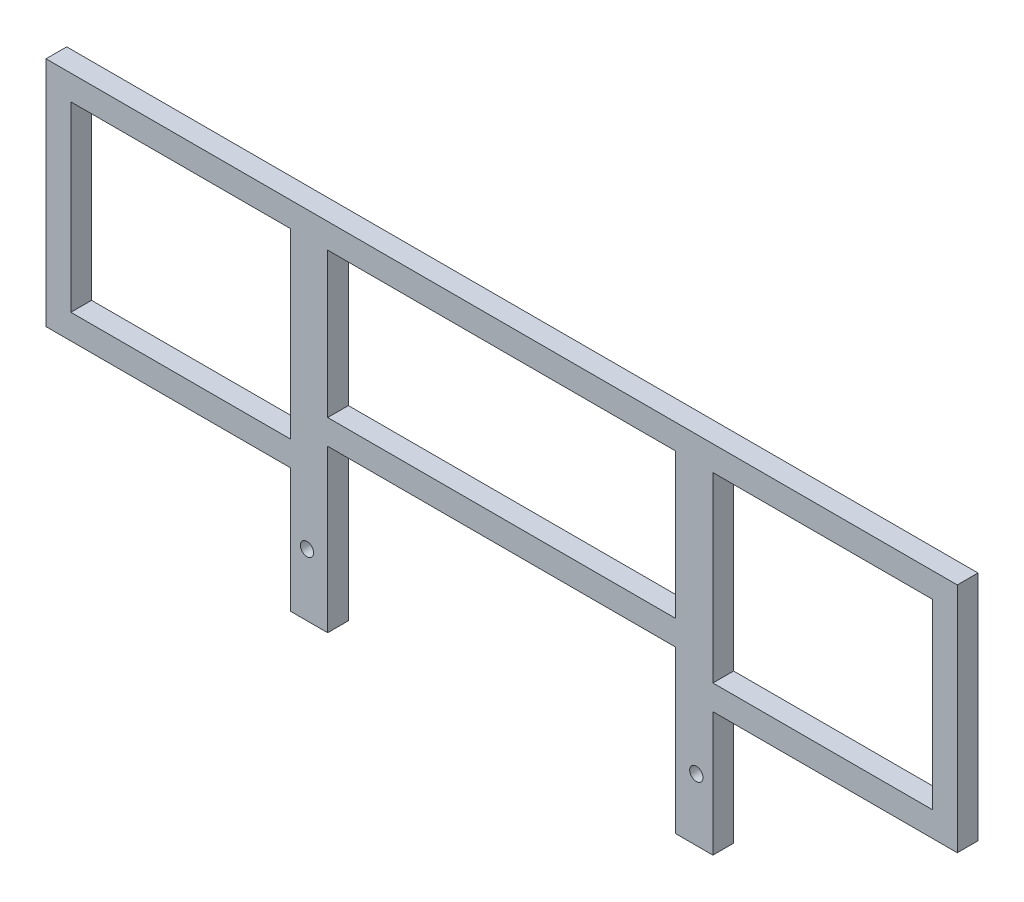
ISO-10303-21;
HEADER;
FILE_DESCRIPTION(('STEP AP214'),'2;1');
FILE_NAME('part.step','',(''),(''),'','','');
FILE_SCHEMA(('AUTOMOTIVE_DESIGN { 1 0 10303 214 1 1 1 1 }'));
ENDSEC;
DATA;
#1=APPLICATION_CONTEXT('core data for automotive mechanical design processes');
#2=APPLICATION_PROTOCOL_DEFINITION('international standard','automotive_design',2000,#1);
#3=PRODUCT_CONTEXT('',#1,'mechanical');
#4=PRODUCT('Part','Part','',(#3));
#5=PRODUCT_RELATED_PRODUCT_CATEGORY('part','',(#4));
#6=PRODUCT_DEFINITION_FORMATION('','',#4);
#7=PRODUCT_DEFINITION_CONTEXT('part definition',#1,'design');
#8=PRODUCT_DEFINITION('design','',#6,#7);
#9=PRODUCT_DEFINITION_SHAPE('','',#8);
#10=(LENGTH_UNIT() NAMED_UNIT(*) SI_UNIT(.MILLI.,.METRE.));
#11=(NAMED_UNIT(*) PLANE_ANGLE_UNIT() SI_UNIT($,.RADIAN.));
#12=(NAMED_UNIT(*) SI_UNIT($,.STERADIAN.) SOLID_ANGLE_UNIT());
#13=UNCERTAINTY_MEASURE_WITH_UNIT(LENGTH_MEASURE(1.E-05),#10,'distance_accuracy_value','');
#14=(GEOMETRIC_REPRESENTATION_CONTEXT(3) GLOBAL_UNCERTAINTY_ASSIGNED_CONTEXT((#13)) GLOBAL_UNIT_ASSIGNED_CONTEXT((#10,
#11,#12)) REPRESENTATION_CONTEXT('',''));
#15=CARTESIAN_POINT('',(0.,0.,0.));
#16=DIRECTION('',(0.,0.,1.));
#17=DIRECTION('',(1.,0.,0.));
#18=AXIS2_PLACEMENT_3D('',#15,#16,#17);
#19=CARTESIAN_POINT('',(0.,0.,5.));
#20=DIRECTION('',(0.,0.,-1.));
#21=DIRECTION('',(-1.,0.,0.));
#22=AXIS2_PLACEMENT_3D('',#19,#20,#21);
#23=PLANE('',#22);
#24=CARTESIAN_POINT('',(63.,-15.,5.));
#25=DIRECTION('',(0.,0.,1.));
#26=DIRECTION('',(1.,0.,0.));
#27=AXIS2_PLACEMENT_3D('',#24,#25,#26);
#28=CIRCLE('',#27,1.6);
#29=CARTESIAN_POINT('',(64.6,-15.,5.));
#30=VERTEX_POINT('',#29);
#31=EDGE_CURVE('E765',#30,#30,#28,.T.);
#32=ORIENTED_EDGE('',*,*,#31,.F.);
#33=EDGE_LOOP('',(#32));
#34=FACE_BOUND('',#33,.T.);
#35=CARTESIAN_POINT('',(157.,-15.,5.));
#36=DIRECTION('',(0.,0.,1.));
#37=DIRECTION('',(1.,0.,0.));
#38=AXIS2_PLACEMENT_3D('',#35,#36,#37);
#39=CIRCLE('',#38,1.59999999999999);
#40=CARTESIAN_POINT('',(158.6,-15.,5.));
#41=VERTEX_POINT('',#40);
#42=EDGE_CURVE('E773',#41,#41,#39,.T.);
#43=ORIENTED_EDGE('',*,*,#42,.F.);
#44=EDGE_LOOP('',(#43));
#45=FACE_BOUND('',#44,.T.);
#46=DIRECTION('',(0.,-1.,0.));
#47=VECTOR('',#46,1.);
#48=CARTESIAN_POINT('',(161.,50.,5.));
#49=LINE('',#48,#47);
#50=CARTESIAN_POINT('',(161.,50.,5.));
#51=VERTEX_POINT('',#50);
#52=CARTESIAN_POINT('',(161.,6.,5.));
#53=VERTEX_POINT('',#52);
#54=EDGE_CURVE('E250',#51,#53,#49,.T.);
#55=ORIENTED_EDGE('',*,*,#54,.F.);
#56=DIRECTION('',(-1.,0.,0.));
#57=VECTOR('',#56,1.);
#58=CARTESIAN_POINT('',(161.,50.,5.));
#59=LINE('',#58,#57);
#60=CARTESIAN_POINT('',(214.,50.,5.));
#61=VERTEX_POINT('',#60);
#62=EDGE_CURVE('E261',#61,#51,#59,.T.);
#63=ORIENTED_EDGE('',*,*,#62,.F.);
#64=DIRECTION('',(0.,1.,0.));
#65=VECTOR('',#64,1.);
#66=CARTESIAN_POINT('',(214.,50.,5.));
#67=LINE('',#66,#65);
#68=CARTESIAN_POINT('',(214.,6.,5.));
#69=VERTEX_POINT('',#68);
#70=EDGE_CURVE('E257',#69,#61,#67,.T.);
#71=ORIENTED_EDGE('',*,*,#70,.F.);
#72=DIRECTION('',(1.,0.,0.));
#73=VECTOR('',#72,1.);
#74=CARTESIAN_POINT('',(161.,6.,5.));
#75=LINE('',#74,#73);
#76=EDGE_CURVE('E253',#53,#69,#75,.T.);
#77=ORIENTED_EDGE('',*,*,#76,.F.);
#78=EDGE_LOOP('',(#55,#63,#71,#77));
#79=FACE_BOUND('',#78,.T.);
#80=DIRECTION('',(0.,-1.,0.));
#81=VECTOR('',#80,1.);
#82=CARTESIAN_POINT('',(0.,0.,5.));
#83=LINE('',#82,#81);
#84=CARTESIAN_POINT('',(0.,56.,5.));
#85=VERTEX_POINT('',#84);
#86=CARTESIAN_POINT('',(0.,0.,5.));
#87=VERTEX_POINT('',#86);
#88=EDGE_CURVE('E336',#85,#87,#83,.T.);
#89=ORIENTED_EDGE('',*,*,#88,.T.);
#90=DIRECTION('',(1.,0.,0.));
#91=VECTOR('',#90,1.);
#92=CARTESIAN_POINT('',(0.,0.,5.));
#93=LINE('',#92,#91);
#94=CARTESIAN_POINT('',(59.,0.,5.));
#95=VERTEX_POINT('',#94);
#96=EDGE_CURVE('E340',#87,#95,#93,.T.);
#97=ORIENTED_EDGE('',*,*,#96,.T.);
#98=DIRECTION('',(0.,-1.,0.));
#99=VECTOR('',#98,1.);
#100=CARTESIAN_POINT('',(59.,0.,5.));
#101=LINE('',#100,#99);
#102=CARTESIAN_POINT('',(59.,-30.,5.));
#103=VERTEX_POINT('',#102);
#104=EDGE_CURVE('E344',#95,#103,#101,.T.);
#105=ORIENTED_EDGE('',*,*,#104,.T.);
#106=DIRECTION('',(1.,0.,0.));
#107=VECTOR('',#106,1.);
#108=CARTESIAN_POINT('',(59.,-30.,5.));
#109=LINE('',#108,#107);
#110=CARTESIAN_POINT('',(68.,-30.,5.));
#111=VERTEX_POINT('',#110);
#112=EDGE_CURVE('E347',#103,#111,#109,.T.);
#113=ORIENTED_EDGE('',*,*,#112,.T.);
#114=DIRECTION('',(0.,1.,0.));
#115=VECTOR('',#114,1.);
#116=CARTESIAN_POINT('',(68.,-30.,5.));
#117=LINE('',#116,#115);
#118=CARTESIAN_POINT('',(68.,9.,5.));
#119=VERTEX_POINT('',#118);
#120=EDGE_CURVE('E350',#111,#119,#117,.T.);
#121=ORIENTED_EDGE('',*,*,#120,.T.);
#122=DIRECTION('',(1.,0.,0.));
#123=VECTOR('',#122,1.);
#124=CARTESIAN_POINT('',(68.,9.,5.));
#125=LINE('',#124,#123);
#126=CARTESIAN_POINT('',(152.,9.,5.));
#127=VERTEX_POINT('',#126);
#128=EDGE_CURVE('E353',#119,#127,#125,.T.);
#129=ORIENTED_EDGE('',*,*,#128,.T.);
#130=DIRECTION('',(0.,-1.,0.));
#131=VECTOR('',#130,1.);
#132=CARTESIAN_POINT('',(152.,-30.,5.));
#133=LINE('',#132,#131);
#134=CARTESIAN_POINT('',(152.,-30.,5.));
#135=VERTEX_POINT('',#134);
#136=EDGE_CURVE('E356',#127,#135,#133,.T.);
#137=ORIENTED_EDGE('',*,*,#136,.T.);
#138=DIRECTION('',(1.,0.,0.));
#139=VECTOR('',#138,1.);
#140=CARTESIAN_POINT('',(152.,-30.,5.));
#141=LINE('',#140,#139);
#142=CARTESIAN_POINT('',(161.,-30.,5.));
#143=VERTEX_POINT('',#142);
#144=EDGE_CURVE('E359',#135,#143,#141,.T.);
#145=ORIENTED_EDGE('',*,*,#144,.T.);
#146=DIRECTION('',(0.,1.,0.));
#147=VECTOR('',#146,1.);
#148=CARTESIAN_POINT('',(161.,0.,5.));
#149=LINE('',#148,#147);
#150=CARTESIAN_POINT('',(161.,0.,5.));
#151=VERTEX_POINT('',#150);
#152=EDGE_CURVE('E362',#143,#151,#149,.T.);
#153=ORIENTED_EDGE('',*,*,#152,.T.);
#154=DIRECTION('',(1.,0.,0.));
#155=VECTOR('',#154,1.);
#156=CARTESIAN_POINT('',(161.,0.,5.));
#157=LINE('',#156,#155);
#158=CARTESIAN_POINT('',(220.,0.,5.));
#159=VERTEX_POINT('',#158);
#160=EDGE_CURVE('E365',#151,#159,#157,.T.);
#161=ORIENTED_EDGE('',*,*,#160,.T.);
#162=DIRECTION('',(0.,1.,0.));
#163=VECTOR('',#162,1.);
#164=CARTESIAN_POINT('',(220.,0.,5.));
#165=LINE('',#164,#163);
#166=CARTESIAN_POINT('',(220.,56.,5.));
#167=VERTEX_POINT('',#166);
#168=EDGE_CURVE('E368',#159,#167,#165,.T.);
#169=ORIENTED_EDGE('',*,*,#168,.T.);
#170=DIRECTION('',(-1.,0.,0.));
#171=VECTOR('',#170,1.);
#172=CARTESIAN_POINT('',(0.,56.,5.));
#173=LINE('',#172,#171);
#174=EDGE_CURVE('E371',#167,#85,#173,.T.);
#175=ORIENTED_EDGE('',*,*,#174,.T.);
#176=EDGE_LOOP('',(#89,#97,#105,#113,#121,#129,#137,#145,#153,#161,#169,#175));
#177=FACE_BOUND('',#176,.T.);
#178=DIRECTION('',(0.,-1.,0.));
#179=VECTOR('',#178,1.);
#180=CARTESIAN_POINT('',(6.,50.,5.));
#181=LINE('',#180,#179);
#182=CARTESIAN_POINT('',(6.,50.,5.));
#183=VERTEX_POINT('',#182);
#184=CARTESIAN_POINT('',(6.00000000000001,6.,5.));
#185=VERTEX_POINT('',#184);
#186=EDGE_CURVE('E293',#183,#185,#181,.T.);
#187=ORIENTED_EDGE('',*,*,#186,.F.);
#188=DIRECTION('',(-1.,0.,0.));
#189=VECTOR('',#188,1.);
#190=CARTESIAN_POINT('',(6.,50.,5.));
#191=LINE('',#190,#189);
#192=CARTESIAN_POINT('',(59.,50.,5.));
#193=VERTEX_POINT('',#192);
#194=EDGE_CURVE('E304',#193,#183,#191,.T.);
#195=ORIENTED_EDGE('',*,*,#194,.F.);
#196=DIRECTION('',(0.,1.,0.));
#197=VECTOR('',#196,1.);
#198=CARTESIAN_POINT('',(59.,50.,5.));
#199=LINE('',#198,#197);
#200=CARTESIAN_POINT('',(59.,6.,5.));
#201=VERTEX_POINT('',#200);
#202=EDGE_CURVE('E300',#201,#193,#199,.T.);
#203=ORIENTED_EDGE('',*,*,#202,.F.);
#204=DIRECTION('',(1.,0.,0.));
#205=VECTOR('',#204,1.);
#206=CARTESIAN_POINT('',(6.00000000000001,6.,5.));
#207=LINE('',#206,#205);
#208=EDGE_CURVE('E296',#185,#201,#207,.T.);
#209=ORIENTED_EDGE('',*,*,#208,.F.);
#210=EDGE_LOOP('',(#187,#195,#203,#209));
#211=FACE_BOUND('',#210,.T.);
#212=DIRECTION('',(0.,-1.,0.));
#213=VECTOR('',#212,1.);
#214=CARTESIAN_POINT('',(68.,50.,5.));
#215=LINE('',#214,#213);
#216=CARTESIAN_POINT('',(68.,50.,5.));
#217=VERTEX_POINT('',#216);
#218=CARTESIAN_POINT('',(68.,15.,5.));
#219=VERTEX_POINT('',#218);
#220=EDGE_CURVE('E200',#217,#219,#215,.T.);
#221=ORIENTED_EDGE('',*,*,#220,.F.);
#222=DIRECTION('',(-1.,0.,0.));
#223=VECTOR('',#222,1.);
#224=CARTESIAN_POINT('',(68.,50.,5.));
#225=LINE('',#224,#223);
#226=CARTESIAN_POINT('',(152.,50.,5.));
#227=VERTEX_POINT('',#226);
#228=EDGE_CURVE('E226',#227,#217,#225,.T.);
#229=ORIENTED_EDGE('',*,*,#228,.F.);
#230=DIRECTION('',(0.,1.,0.));
#231=VECTOR('',#230,1.);
#232=CARTESIAN_POINT('',(152.,50.,5.));
#233=LINE('',#232,#231);
#234=CARTESIAN_POINT('',(152.,15.,5.));
#235=VERTEX_POINT('',#234);
#236=EDGE_CURVE('E222',#235,#227,#233,.T.);
#237=ORIENTED_EDGE('',*,*,#236,.F.);
#238=DIRECTION('',(1.,0.,0.));
#239=VECTOR('',#238,1.);
#240=CARTESIAN_POINT('',(68.,15.,5.));
#241=LINE('',#240,#239);
#242=EDGE_CURVE('E209',#219,#235,#241,.T.);
#243=ORIENTED_EDGE('',*,*,#242,.F.);
#244=EDGE_LOOP('',(#221,#229,#237,#243));
#245=FACE_BOUND('',#244,.T.);
#246=ADVANCED_FACE('F38',(#34,#45,#79,#177,#211,#245),#23,.F.);
#247=CARTESIAN_POINT('',(0.,0.,0.));
#248=DIRECTION('',(0.,0.,-1.));
#249=DIRECTION('',(-1.,0.,0.));
#250=AXIS2_PLACEMENT_3D('',#247,#248,#249);
#251=PLANE('',#250);
#252=CARTESIAN_POINT('',(63.,-15.,0.));
#253=DIRECTION('',(0.,0.,1.));
#254=DIRECTION('',(1.,0.,0.));
#255=AXIS2_PLACEMENT_3D('',#252,#253,#254);
#256=CIRCLE('',#255,1.6);
#257=CARTESIAN_POINT('',(64.6,-15.,0.));
#258=VERTEX_POINT('',#257);
#259=EDGE_CURVE('E234',#258,#258,#256,.T.);
#260=ORIENTED_EDGE('',*,*,#259,.T.);
#261=EDGE_LOOP('',(#260));
#262=FACE_BOUND('',#261,.T.);
#263=CARTESIAN_POINT('',(157.,-15.,0.));
#264=DIRECTION('',(0.,0.,1.));
#265=DIRECTION('',(1.,0.,0.));
#266=AXIS2_PLACEMENT_3D('',#263,#264,#265);
#267=CIRCLE('',#266,1.59999999999999);
#268=CARTESIAN_POINT('',(158.6,-15.,0.));
#269=VERTEX_POINT('',#268);
#270=EDGE_CURVE('E767',#269,#269,#267,.T.);
#271=ORIENTED_EDGE('',*,*,#270,.T.);
#272=EDGE_LOOP('',(#271));
#273=FACE_BOUND('',#272,.T.);
#274=DIRECTION('',(0.,-1.,0.));
#275=VECTOR('',#274,1.);
#276=CARTESIAN_POINT('',(0.,0.,0.));
#277=LINE('',#276,#275);
#278=CARTESIAN_POINT('',(0.,56.,0.));
#279=VERTEX_POINT('',#278);
#280=CARTESIAN_POINT('',(0.,0.,0.));
#281=VERTEX_POINT('',#280);
#282=EDGE_CURVE('E335',#279,#281,#277,.T.);
#283=ORIENTED_EDGE('',*,*,#282,.F.);
#284=DIRECTION('',(-1.,0.,0.));
#285=VECTOR('',#284,1.);
#286=CARTESIAN_POINT('',(0.,56.,0.));
#287=LINE('',#286,#285);
#288=CARTESIAN_POINT('',(220.,56.,0.));
#289=VERTEX_POINT('',#288);
#290=EDGE_CURVE('E341',#289,#279,#287,.T.);
#291=ORIENTED_EDGE('',*,*,#290,.F.);
#292=DIRECTION('',(0.,1.,0.));
#293=VECTOR('',#292,1.);
#294=CARTESIAN_POINT('',(220.,0.,0.));
#295=LINE('',#294,#293);
#296=CARTESIAN_POINT('',(220.,0.,0.));
#297=VERTEX_POINT('',#296);
#298=EDGE_CURVE('E405',#297,#289,#295,.T.);
#299=ORIENTED_EDGE('',*,*,#298,.F.);
#300=DIRECTION('',(1.,0.,0.));
#301=VECTOR('',#300,1.);
#302=CARTESIAN_POINT('',(161.,0.,0.));
#303=LINE('',#302,#301);
#304=CARTESIAN_POINT('',(161.,0.,0.));
#305=VERTEX_POINT('',#304);
#306=EDGE_CURVE('E402',#305,#297,#303,.T.);
#307=ORIENTED_EDGE('',*,*,#306,.F.);
#308=DIRECTION('',(0.,1.,0.));
#309=VECTOR('',#308,1.);
#310=CARTESIAN_POINT('',(161.,0.,0.));
#311=LINE('',#310,#309);
#312=CARTESIAN_POINT('',(161.,-30.,0.));
#313=VERTEX_POINT('',#312);
#314=EDGE_CURVE('E399',#313,#305,#311,.T.);
#315=ORIENTED_EDGE('',*,*,#314,.F.);
#316=DIRECTION('',(1.,0.,0.));
#317=VECTOR('',#316,1.);
#318=CARTESIAN_POINT('',(152.,-30.,0.));
#319=LINE('',#318,#317);
#320=CARTESIAN_POINT('',(152.,-30.,0.));
#321=VERTEX_POINT('',#320);
#322=EDGE_CURVE('E396',#321,#313,#319,.T.);
#323=ORIENTED_EDGE('',*,*,#322,.F.);
#324=DIRECTION('',(0.,-1.,0.));
#325=VECTOR('',#324,1.);
#326=CARTESIAN_POINT('',(152.,-30.,0.));
#327=LINE('',#326,#325);
#328=CARTESIAN_POINT('',(152.,9.,0.));
#329=VERTEX_POINT('',#328);
#330=EDGE_CURVE('E393',#329,#321,#327,.T.);
#331=ORIENTED_EDGE('',*,*,#330,.F.);
#332=DIRECTION('',(1.,0.,0.));
#333=VECTOR('',#332,1.);
#334=CARTESIAN_POINT('',(68.,9.,0.));
#335=LINE('',#334,#333);
#336=CARTESIAN_POINT('',(68.,9.,0.));
#337=VERTEX_POINT('',#336);
#338=EDGE_CURVE('E390',#337,#329,#335,.T.);
#339=ORIENTED_EDGE('',*,*,#338,.F.);
#340=DIRECTION('',(0.,1.,0.));
#341=VECTOR('',#340,1.);
#342=CARTESIAN_POINT('',(68.,-30.,0.));
#343=LINE('',#342,#341);
#344=CARTESIAN_POINT('',(68.,-30.,0.));
#345=VERTEX_POINT('',#344);
#346=EDGE_CURVE('E387',#345,#337,#343,.T.);
#347=ORIENTED_EDGE('',*,*,#346,.F.);
#348=DIRECTION('',(1.,0.,0.));
#349=VECTOR('',#348,1.);
#350=CARTESIAN_POINT('',(59.,-30.,0.));
#351=LINE('',#350,#349);
#352=CARTESIAN_POINT('',(59.,-30.,0.));
#353=VERTEX_POINT('',#352);
#354=EDGE_CURVE('E384',#353,#345,#351,.T.);
#355=ORIENTED_EDGE('',*,*,#354,.F.);
#356=DIRECTION('',(0.,-1.,0.));
#357=VECTOR('',#356,1.);
#358=CARTESIAN_POINT('',(59.,0.,0.));
#359=LINE('',#358,#357);
#360=CARTESIAN_POINT('',(59.,0.,0.));
#361=VERTEX_POINT('',#360);
#362=EDGE_CURVE('E381',#361,#353,#359,.T.);
#363=ORIENTED_EDGE('',*,*,#362,.F.);
#364=DIRECTION('',(1.,0.,0.));
#365=VECTOR('',#364,1.);
#366=CARTESIAN_POINT('',(0.,0.,0.));
#367=LINE('',#366,#365);
#368=EDGE_CURVE('E378',#281,#361,#367,.T.);
#369=ORIENTED_EDGE('',*,*,#368,.F.);
#370=EDGE_LOOP('',(#283,#291,#299,#307,#315,#323,#331,#339,#347,#355,#363,#369));
#371=FACE_BOUND('',#370,.T.);
#372=DIRECTION('',(-1.,0.,0.));
#373=VECTOR('',#372,1.);
#374=CARTESIAN_POINT('',(6.,50.,0.));
#375=LINE('',#374,#373);
#376=CARTESIAN_POINT('',(59.,50.,0.));
#377=VERTEX_POINT('',#376);
#378=CARTESIAN_POINT('',(6.,50.,0.));
#379=VERTEX_POINT('',#378);
#380=EDGE_CURVE('E297',#377,#379,#375,.T.);
#381=ORIENTED_EDGE('',*,*,#380,.T.);
#382=DIRECTION('',(0.,-1.,0.));
#383=VECTOR('',#382,1.);
#384=CARTESIAN_POINT('',(6.,50.,0.));
#385=LINE('',#384,#383);
#386=CARTESIAN_POINT('',(6.00000000000001,6.,0.));
#387=VERTEX_POINT('',#386);
#388=EDGE_CURVE('E292',#379,#387,#385,.T.);
#389=ORIENTED_EDGE('',*,*,#388,.T.);
#390=DIRECTION('',(1.,0.,0.));
#391=VECTOR('',#390,1.);
#392=CARTESIAN_POINT('',(6.00000000000001,6.,0.));
#393=LINE('',#392,#391);
#394=CARTESIAN_POINT('',(59.,6.,0.));
#395=VERTEX_POINT('',#394);
#396=EDGE_CURVE('E311',#387,#395,#393,.T.);
#397=ORIENTED_EDGE('',*,*,#396,.T.);
#398=DIRECTION('',(0.,1.,0.));
#399=VECTOR('',#398,1.);
#400=CARTESIAN_POINT('',(59.,50.,0.));
#401=LINE('',#400,#399);
#402=EDGE_CURVE('E315',#395,#377,#401,.T.);
#403=ORIENTED_EDGE('',*,*,#402,.T.);
#404=EDGE_LOOP('',(#381,#389,#397,#403));
#405=FACE_BOUND('',#404,.T.);
#406=DIRECTION('',(-1.,0.,0.));
#407=VECTOR('',#406,1.);
#408=CARTESIAN_POINT('',(161.,50.,0.));
#409=LINE('',#408,#407);
#410=CARTESIAN_POINT('',(214.,50.,0.));
#411=VERTEX_POINT('',#410);
#412=CARTESIAN_POINT('',(161.,50.,0.));
#413=VERTEX_POINT('',#412);
#414=EDGE_CURVE('E254',#411,#413,#409,.T.);
#415=ORIENTED_EDGE('',*,*,#414,.T.);
#416=DIRECTION('',(0.,-1.,0.));
#417=VECTOR('',#416,1.);
#418=CARTESIAN_POINT('',(161.,50.,0.));
#419=LINE('',#418,#417);
#420=CARTESIAN_POINT('',(161.,6.,0.));
#421=VERTEX_POINT('',#420);
#422=EDGE_CURVE('E218',#413,#421,#419,.T.);
#423=ORIENTED_EDGE('',*,*,#422,.T.);
#424=DIRECTION('',(1.,0.,0.));
#425=VECTOR('',#424,1.);
#426=CARTESIAN_POINT('',(161.,6.,0.));
#427=LINE('',#426,#425);
#428=CARTESIAN_POINT('',(214.,6.,0.));
#429=VERTEX_POINT('',#428);
#430=EDGE_CURVE('E268',#421,#429,#427,.T.);
#431=ORIENTED_EDGE('',*,*,#430,.T.);
#432=DIRECTION('',(0.,1.,0.));
#433=VECTOR('',#432,1.);
#434=CARTESIAN_POINT('',(214.,50.,0.));
#435=LINE('',#434,#433);
#436=EDGE_CURVE('E272',#429,#411,#435,.T.);
#437=ORIENTED_EDGE('',*,*,#436,.T.);
#438=EDGE_LOOP('',(#415,#423,#431,#437));
#439=FACE_BOUND('',#438,.T.);
#440=DIRECTION('',(-1.,0.,0.));
#441=VECTOR('',#440,1.);
#442=CARTESIAN_POINT('',(68.,50.,0.));
#443=LINE('',#442,#441);
#444=CARTESIAN_POINT('',(152.,50.,0.));
#445=VERTEX_POINT('',#444);
#446=CARTESIAN_POINT('',(68.,50.,0.));
#447=VERTEX_POINT('',#446);
#448=EDGE_CURVE('E210',#445,#447,#443,.T.);
#449=ORIENTED_EDGE('',*,*,#448,.T.);
#450=DIRECTION('',(0.,-1.,0.));
#451=VECTOR('',#450,1.);
#452=CARTESIAN_POINT('',(68.,50.,0.));
#453=LINE('',#452,#451);
#454=CARTESIAN_POINT('',(68.,15.,0.));
#455=VERTEX_POINT('',#454);
#456=EDGE_CURVE('E62',#447,#455,#453,.T.);
#457=ORIENTED_EDGE('',*,*,#456,.T.);
#458=DIRECTION('',(1.,0.,0.));
#459=VECTOR('',#458,1.);
#460=CARTESIAN_POINT('',(68.,15.,0.));
#461=LINE('',#460,#459);
#462=CARTESIAN_POINT('',(152.,15.,0.));
#463=VERTEX_POINT('',#462);
#464=EDGE_CURVE('E216',#455,#463,#461,.T.);
#465=ORIENTED_EDGE('',*,*,#464,.T.);
#466=DIRECTION('',(0.,1.,0.));
#467=VECTOR('',#466,1.);
#468=CARTESIAN_POINT('',(152.,50.,0.));
#469=LINE('',#468,#467);
#470=EDGE_CURVE('E237',#463,#445,#469,.T.);
#471=ORIENTED_EDGE('',*,*,#470,.T.);
#472=EDGE_LOOP('',(#449,#457,#465,#471));
#473=FACE_BOUND('',#472,.T.);
#474=ADVANCED_FACE('F460',(#262,#273,#371,#405,#439,#473),#251,.T.);
#475=CARTESIAN_POINT('',(0.,0.,5.));
#476=DIRECTION('',(1.,0.,0.));
#477=DIRECTION('',(0.,0.,-1.));
#478=AXIS2_PLACEMENT_3D('',#475,#476,#477);
#479=PLANE('',#478);
#480=ORIENTED_EDGE('',*,*,#282,.T.);
#481=DIRECTION('',(0.,0.,-1.));
#482=VECTOR('',#481,1.);
#483=CARTESIAN_POINT('',(0.,0.,5.));
#484=LINE('',#483,#482);
#485=EDGE_CURVE('E11',#87,#281,#484,.T.);
#486=ORIENTED_EDGE('',*,*,#485,.F.);
#487=ORIENTED_EDGE('',*,*,#88,.F.);
#488=DIRECTION('',(0.,0.,-1.));
#489=VECTOR('',#488,1.);
#490=CARTESIAN_POINT('',(0.,56.,5.));
#491=LINE('',#490,#489);
#492=EDGE_CURVE('E374',#85,#279,#491,.T.);
#493=ORIENTED_EDGE('',*,*,#492,.T.);
#494=EDGE_LOOP('',(#480,#486,#487,#493));
#495=FACE_BOUND('',#494,.T.);
#496=ADVANCED_FACE('F40',(#495),#479,.F.);
#497=CARTESIAN_POINT('',(0.,0.,5.));
#498=DIRECTION('',(0.,1.,0.));
#499=DIRECTION('',(0.,0.,1.));
#500=AXIS2_PLACEMENT_3D('',#497,#498,#499);
#501=PLANE('',#500);
#502=ORIENTED_EDGE('',*,*,#368,.T.);
#503=DIRECTION('',(0.,0.,-1.));
#504=VECTOR('',#503,1.);
#505=CARTESIAN_POINT('',(59.,0.,5.));
#506=LINE('',#505,#504);
#507=EDGE_CURVE('E47',#95,#361,#506,.T.);
#508=ORIENTED_EDGE('',*,*,#507,.F.);
#509=ORIENTED_EDGE('',*,*,#96,.F.);
#510=ORIENTED_EDGE('',*,*,#485,.T.);
#511=EDGE_LOOP('',(#502,#508,#509,#510));
#512=FACE_BOUND('',#511,.T.);
#513=ADVANCED_FACE('F478',(#512),#501,.F.);
#514=CARTESIAN_POINT('',(59.,0.,5.));
#515=DIRECTION('',(1.,0.,0.));
#516=DIRECTION('',(0.,1.,0.));
#517=AXIS2_PLACEMENT_3D('',#514,#515,#516);
#518=PLANE('',#517);
#519=ORIENTED_EDGE('',*,*,#362,.T.);
#520=DIRECTION('',(0.,0.,-1.));
#521=VECTOR('',#520,1.);
#522=CARTESIAN_POINT('',(59.,-30.,5.));
#523=LINE('',#522,#521);
#524=EDGE_CURVE('E445',#103,#353,#523,.T.);
#525=ORIENTED_EDGE('',*,*,#524,.F.);
#526=ORIENTED_EDGE('',*,*,#104,.F.);
#527=ORIENTED_EDGE('',*,*,#507,.T.);
#528=EDGE_LOOP('',(#519,#525,#526,#527));
#529=FACE_BOUND('',#528,.T.);
#530=ADVANCED_FACE('F454',(#529),#518,.F.);
#531=CARTESIAN_POINT('',(59.,-30.,5.));
#532=DIRECTION('',(0.,1.,0.));
#533=DIRECTION('',(0.,0.,1.));
#534=AXIS2_PLACEMENT_3D('',#531,#532,#533);
#535=PLANE('',#534);
#536=ORIENTED_EDGE('',*,*,#354,.T.);
#537=DIRECTION('',(0.,0.,-1.));
#538=VECTOR('',#537,1.);
#539=CARTESIAN_POINT('',(68.,-30.,5.));
#540=LINE('',#539,#538);
#541=EDGE_CURVE('E441',#111,#345,#540,.T.);
#542=ORIENTED_EDGE('',*,*,#541,.F.);
#543=ORIENTED_EDGE('',*,*,#112,.F.);
#544=ORIENTED_EDGE('',*,*,#524,.T.);
#545=EDGE_LOOP('',(#536,#542,#543,#544));
#546=FACE_BOUND('',#545,.T.);
#547=ADVANCED_FACE('F466',(#546),#535,.F.);
#548=CARTESIAN_POINT('',(68.,-30.,5.));
#549=DIRECTION('',(-1.,0.,0.));
#550=DIRECTION('',(0.,0.,1.));
#551=AXIS2_PLACEMENT_3D('',#548,#549,#550);
#552=PLANE('',#551);
#553=ORIENTED_EDGE('',*,*,#346,.T.);
#554=DIRECTION('',(0.,0.,-1.));
#555=VECTOR('',#554,1.);
#556=CARTESIAN_POINT('',(68.,9.,5.));
#557=LINE('',#556,#555);
#558=EDGE_CURVE('E437',#119,#337,#557,.T.);
#559=ORIENTED_EDGE('',*,*,#558,.F.);
#560=ORIENTED_EDGE('',*,*,#120,.F.);
#561=ORIENTED_EDGE('',*,*,#541,.T.);
#562=EDGE_LOOP('',(#553,#559,#560,#561));
#563=FACE_BOUND('',#562,.T.);
#564=ADVANCED_FACE('F470',(#563),#552,.F.);
#565=CARTESIAN_POINT('',(68.,9.,5.));
#566=DIRECTION('',(0.,1.,0.));
#567=DIRECTION('',(0.,0.,1.));
#568=AXIS2_PLACEMENT_3D('',#565,#566,#567);
#569=PLANE('',#568);
#570=ORIENTED_EDGE('',*,*,#338,.T.);
#571=DIRECTION('',(0.,0.,-1.));
#572=VECTOR('',#571,1.);
#573=CARTESIAN_POINT('',(152.,9.,5.));
#574=LINE('',#573,#572);
#575=EDGE_CURVE('E433',#127,#329,#574,.T.);
#576=ORIENTED_EDGE('',*,*,#575,.F.);
#577=ORIENTED_EDGE('',*,*,#128,.F.);
#578=ORIENTED_EDGE('',*,*,#558,.T.);
#579=EDGE_LOOP('',(#570,#576,#577,#578));
#580=FACE_BOUND('',#579,.T.);
#581=ADVANCED_FACE('F511',(#580),#569,.F.);
#582=CARTESIAN_POINT('',(152.,-30.,5.));
#583=DIRECTION('',(1.,0.,0.));
#584=DIRECTION('',(0.,0.,-1.));
#585=AXIS2_PLACEMENT_3D('',#582,#583,#584);
#586=PLANE('',#585);
#587=ORIENTED_EDGE('',*,*,#330,.T.);
#588=DIRECTION('',(0.,0.,-1.));
#589=VECTOR('',#588,1.);
#590=CARTESIAN_POINT('',(152.,-30.,5.));
#591=LINE('',#590,#589);
#592=EDGE_CURVE('E429',#135,#321,#591,.T.);
#593=ORIENTED_EDGE('',*,*,#592,.F.);
#594=ORIENTED_EDGE('',*,*,#136,.F.);
#595=ORIENTED_EDGE('',*,*,#575,.T.);
#596=EDGE_LOOP('',(#587,#593,#594,#595));
#597=FACE_BOUND('',#596,.T.);
#598=ADVANCED_FACE('F509',(#597),#586,.F.);
#599=CARTESIAN_POINT('',(152.,-30.,5.));
#600=DIRECTION('',(0.,1.,0.));
#601=DIRECTION('',(-1.,0.,0.));
#602=AXIS2_PLACEMENT_3D('',#599,#600,#601);
#603=PLANE('',#602);
#604=ORIENTED_EDGE('',*,*,#322,.T.);
#605=DIRECTION('',(0.,0.,-1.));
#606=VECTOR('',#605,1.);
#607=CARTESIAN_POINT('',(161.,-30.,5.));
#608=LINE('',#607,#606);
#609=EDGE_CURVE('E425',#143,#313,#608,.T.);
#610=ORIENTED_EDGE('',*,*,#609,.F.);
#611=ORIENTED_EDGE('',*,*,#144,.F.);
#612=ORIENTED_EDGE('',*,*,#592,.T.);
#613=EDGE_LOOP('',(#604,#610,#611,#612));
#614=FACE_BOUND('',#613,.T.);
#615=ADVANCED_FACE('F505',(#614),#603,.F.);
#616=CARTESIAN_POINT('',(161.,0.,5.));
#617=DIRECTION('',(-1.,0.,0.));
#618=DIRECTION('',(0.,0.,1.));
#619=AXIS2_PLACEMENT_3D('',#616,#617,#618);
#620=PLANE('',#619);
#621=ORIENTED_EDGE('',*,*,#314,.T.);
#622=DIRECTION('',(0.,0.,-1.));
#623=VECTOR('',#622,1.);
#624=CARTESIAN_POINT('',(161.,0.,5.));
#625=LINE('',#624,#623);
#626=EDGE_CURVE('E421',#151,#305,#625,.T.);
#627=ORIENTED_EDGE('',*,*,#626,.F.);
#628=ORIENTED_EDGE('',*,*,#152,.F.);
#629=ORIENTED_EDGE('',*,*,#609,.T.);
#630=EDGE_LOOP('',(#621,#627,#628,#629));
#631=FACE_BOUND('',#630,.T.);
#632=ADVANCED_FACE('F500',(#631),#620,.F.);
#633=CARTESIAN_POINT('',(161.,0.,5.));
#634=DIRECTION('',(0.,1.,0.));
#635=DIRECTION('',(-1.,0.,0.));
#636=AXIS2_PLACEMENT_3D('',#633,#634,#635);
#637=PLANE('',#636);
#638=ORIENTED_EDGE('',*,*,#306,.T.);
#639=DIRECTION('',(0.,0.,-1.));
#640=VECTOR('',#639,1.);
#641=CARTESIAN_POINT('',(220.,0.,5.));
#642=LINE('',#641,#640);
#643=EDGE_CURVE('E417',#159,#297,#642,.T.);
#644=ORIENTED_EDGE('',*,*,#643,.F.);
#645=ORIENTED_EDGE('',*,*,#160,.F.);
#646=ORIENTED_EDGE('',*,*,#626,.T.);
#647=EDGE_LOOP('',(#638,#644,#645,#646));
#648=FACE_BOUND('',#647,.T.);
#649=ADVANCED_FACE('F494',(#648),#637,.F.);
#650=CARTESIAN_POINT('',(220.,0.,5.));
#651=DIRECTION('',(-1.,0.,0.));
#652=DIRECTION('',(0.,0.,1.));
#653=AXIS2_PLACEMENT_3D('',#650,#651,#652);
#654=PLANE('',#653);
#655=ORIENTED_EDGE('',*,*,#298,.T.);
#656=DIRECTION('',(0.,0.,-1.));
#657=VECTOR('',#656,1.);
#658=CARTESIAN_POINT('',(220.,56.,5.));
#659=LINE('',#658,#657);
#660=EDGE_CURVE('E413',#167,#289,#659,.T.);
#661=ORIENTED_EDGE('',*,*,#660,.F.);
#662=ORIENTED_EDGE('',*,*,#168,.F.);
#663=ORIENTED_EDGE('',*,*,#643,.T.);
#664=EDGE_LOOP('',(#655,#661,#662,#663));
#665=FACE_BOUND('',#664,.T.);
#666=ADVANCED_FACE('F490',(#665),#654,.F.);
#667=CARTESIAN_POINT('',(0.,56.,5.));
#668=DIRECTION('',(0.,-1.,0.));
#669=DIRECTION('',(0.,0.,-1.));
#670=AXIS2_PLACEMENT_3D('',#667,#668,#669);
#671=PLANE('',#670);
#672=ORIENTED_EDGE('',*,*,#290,.T.);
#673=ORIENTED_EDGE('',*,*,#492,.F.);
#674=ORIENTED_EDGE('',*,*,#174,.F.);
#675=ORIENTED_EDGE('',*,*,#660,.T.);
#676=EDGE_LOOP('',(#672,#673,#674,#675));
#677=FACE_BOUND('',#676,.T.);
#678=ADVANCED_FACE('F485',(#677),#671,.F.);
#679=CARTESIAN_POINT('',(6.,50.,5.));
#680=DIRECTION('',(1.,0.,0.));
#681=DIRECTION('',(0.,1.,0.));
#682=AXIS2_PLACEMENT_3D('',#679,#680,#681);
#683=PLANE('',#682);
#684=ORIENTED_EDGE('',*,*,#388,.F.);
#685=DIRECTION('',(0.,0.,-1.));
#686=VECTOR('',#685,1.);
#687=CARTESIAN_POINT('',(6.,50.,5.));
#688=LINE('',#687,#686);
#689=EDGE_CURVE('E307',#183,#379,#688,.T.);
#690=ORIENTED_EDGE('',*,*,#689,.F.);
#691=ORIENTED_EDGE('',*,*,#186,.T.);
#692=DIRECTION('',(0.,0.,-1.));
#693=VECTOR('',#692,1.);
#694=CARTESIAN_POINT('',(6.00000000000001,6.,5.));
#695=LINE('',#694,#693);
#696=EDGE_CURVE('E331',#185,#387,#695,.T.);
#697=ORIENTED_EDGE('',*,*,#696,.T.);
#698=EDGE_LOOP('',(#684,#690,#691,#697));
#699=FACE_BOUND('',#698,.T.);
#700=ADVANCED_FACE('F532',(#699),#683,.T.);
#701=CARTESIAN_POINT('',(6.00000000000001,6.,5.));
#702=DIRECTION('',(0.,1.,0.));
#703=DIRECTION('',(0.,0.,1.));
#704=AXIS2_PLACEMENT_3D('',#701,#702,#703);
#705=PLANE('',#704);
#706=ORIENTED_EDGE('',*,*,#396,.F.);
#707=ORIENTED_EDGE('',*,*,#696,.F.);
#708=ORIENTED_EDGE('',*,*,#208,.T.);
#709=DIRECTION('',(0.,0.,-1.));
#710=VECTOR('',#709,1.);
#711=CARTESIAN_POINT('',(59.,6.,5.));
#712=LINE('',#711,#710);
#713=EDGE_CURVE('E328',#201,#395,#712,.T.);
#714=ORIENTED_EDGE('',*,*,#713,.T.);
#715=EDGE_LOOP('',(#706,#707,#708,#714));
#716=FACE_BOUND('',#715,.T.);
#717=ADVANCED_FACE('F570',(#716),#705,.T.);
#718=CARTESIAN_POINT('',(59.,50.,5.));
#719=DIRECTION('',(-1.,0.,0.));
#720=DIRECTION('',(0.,-1.,0.));
#721=AXIS2_PLACEMENT_3D('',#718,#719,#720);
#722=PLANE('',#721);
#723=ORIENTED_EDGE('',*,*,#402,.F.);
#724=ORIENTED_EDGE('',*,*,#713,.F.);
#725=ORIENTED_EDGE('',*,*,#202,.T.);
#726=DIRECTION('',(0.,0.,-1.));
#727=VECTOR('',#726,1.);
#728=CARTESIAN_POINT('',(59.,50.,5.));
#729=LINE('',#728,#727);
#730=EDGE_CURVE('E325',#193,#377,#729,.T.);
#731=ORIENTED_EDGE('',*,*,#730,.T.);
#732=EDGE_LOOP('',(#723,#724,#725,#731));
#733=FACE_BOUND('',#732,.T.);
#734=ADVANCED_FACE('F577',(#733),#722,.T.);
#735=CARTESIAN_POINT('',(6.,50.,5.));
#736=DIRECTION('',(0.,-1.,0.));
#737=DIRECTION('',(0.,0.,-1.));
#738=AXIS2_PLACEMENT_3D('',#735,#736,#737);
#739=PLANE('',#738);
#740=ORIENTED_EDGE('',*,*,#380,.F.);
#741=ORIENTED_EDGE('',*,*,#730,.F.);
#742=ORIENTED_EDGE('',*,*,#194,.T.);
#743=ORIENTED_EDGE('',*,*,#689,.T.);
#744=EDGE_LOOP('',(#740,#741,#742,#743));
#745=FACE_BOUND('',#744,.T.);
#746=ADVANCED_FACE('F584',(#745),#739,.T.);
#747=CARTESIAN_POINT('',(161.,50.,5.));
#748=DIRECTION('',(1.,0.,0.));
#749=DIRECTION('',(0.,0.,-1.));
#750=AXIS2_PLACEMENT_3D('',#747,#748,#749);
#751=PLANE('',#750);
#752=ORIENTED_EDGE('',*,*,#422,.F.);
#753=DIRECTION('',(0.,0.,-1.));
#754=VECTOR('',#753,1.);
#755=CARTESIAN_POINT('',(161.,50.,5.));
#756=LINE('',#755,#754);
#757=EDGE_CURVE('E264',#51,#413,#756,.T.);
#758=ORIENTED_EDGE('',*,*,#757,.F.);
#759=ORIENTED_EDGE('',*,*,#54,.T.);
#760=DIRECTION('',(0.,0.,-1.));
#761=VECTOR('',#760,1.);
#762=CARTESIAN_POINT('',(161.,6.,5.));
#763=LINE('',#762,#761);
#764=EDGE_CURVE('E288',#53,#421,#763,.T.);
#765=ORIENTED_EDGE('',*,*,#764,.T.);
#766=EDGE_LOOP('',(#752,#758,#759,#765));
#767=FACE_BOUND('',#766,.T.);
#768=ADVANCED_FACE('F592',(#767),#751,.T.);
#769=CARTESIAN_POINT('',(161.,6.,5.));
#770=DIRECTION('',(0.,1.,0.));
#771=DIRECTION('',(-1.,0.,0.));
#772=AXIS2_PLACEMENT_3D('',#769,#770,#771);
#773=PLANE('',#772);
#774=ORIENTED_EDGE('',*,*,#430,.F.);
#775=ORIENTED_EDGE('',*,*,#764,.F.);
#776=ORIENTED_EDGE('',*,*,#76,.T.);
#777=DIRECTION('',(0.,0.,-1.));
#778=VECTOR('',#777,1.);
#779=CARTESIAN_POINT('',(214.,6.,5.));
#780=LINE('',#779,#778);
#781=EDGE_CURVE('E285',#69,#429,#780,.T.);
#782=ORIENTED_EDGE('',*,*,#781,.T.);
#783=EDGE_LOOP('',(#774,#775,#776,#782));
#784=FACE_BOUND('',#783,.T.);
#785=ADVANCED_FACE('F600',(#784),#773,.T.);
#786=CARTESIAN_POINT('',(214.,50.,5.));
#787=DIRECTION('',(-1.,0.,0.));
#788=DIRECTION('',(0.,0.,1.));
#789=AXIS2_PLACEMENT_3D('',#786,#787,#788);
#790=PLANE('',#789);
#791=ORIENTED_EDGE('',*,*,#436,.F.);
#792=ORIENTED_EDGE('',*,*,#781,.F.);
#793=ORIENTED_EDGE('',*,*,#70,.T.);
#794=DIRECTION('',(0.,0.,-1.));
#795=VECTOR('',#794,1.);
#796=CARTESIAN_POINT('',(214.,50.,5.));
#797=LINE('',#796,#795);
#798=EDGE_CURVE('E282',#61,#411,#797,.T.);
#799=ORIENTED_EDGE('',*,*,#798,.T.);
#800=EDGE_LOOP('',(#791,#792,#793,#799));
#801=FACE_BOUND('',#800,.T.);
#802=ADVANCED_FACE('F608',(#801),#790,.T.);
#803=CARTESIAN_POINT('',(161.,50.,5.));
#804=DIRECTION('',(0.,-1.,0.));
#805=DIRECTION('',(0.,0.,-1.));
#806=AXIS2_PLACEMENT_3D('',#803,#804,#805);
#807=PLANE('',#806);
#808=ORIENTED_EDGE('',*,*,#414,.F.);
#809=ORIENTED_EDGE('',*,*,#798,.F.);
#810=ORIENTED_EDGE('',*,*,#62,.T.);
#811=ORIENTED_EDGE('',*,*,#757,.T.);
#812=EDGE_LOOP('',(#808,#809,#810,#811));
#813=FACE_BOUND('',#812,.T.);
#814=ADVANCED_FACE('F616',(#813),#807,.T.);
#815=CARTESIAN_POINT('',(68.,50.,5.));
#816=DIRECTION('',(1.,0.,0.));
#817=DIRECTION('',(0.,1.,0.));
#818=AXIS2_PLACEMENT_3D('',#815,#816,#817);
#819=PLANE('',#818);
#820=ORIENTED_EDGE('',*,*,#456,.F.);
#821=DIRECTION('',(0.,0.,-1.));
#822=VECTOR('',#821,1.);
#823=CARTESIAN_POINT('',(68.,50.,5.));
#824=LINE('',#823,#822);
#825=EDGE_CURVE('E204',#217,#447,#824,.T.);
#826=ORIENTED_EDGE('',*,*,#825,.F.);
#827=ORIENTED_EDGE('',*,*,#220,.T.);
#828=DIRECTION('',(0.,0.,-1.));
#829=VECTOR('',#828,1.);
#830=CARTESIAN_POINT('',(68.,15.,5.));
#831=LINE('',#830,#829);
#832=EDGE_CURVE('E203',#219,#455,#831,.T.);
#833=ORIENTED_EDGE('',*,*,#832,.T.);
#834=EDGE_LOOP('',(#820,#826,#827,#833));
#835=FACE_BOUND('',#834,.T.);
#836=ADVANCED_FACE('F202',(#835),#819,.T.);
#837=CARTESIAN_POINT('',(68.,15.,5.));
#838=DIRECTION('',(0.,1.,0.));
#839=DIRECTION('',(0.,0.,1.));
#840=AXIS2_PLACEMENT_3D('',#837,#838,#839);
#841=PLANE('',#840);
#842=ORIENTED_EDGE('',*,*,#464,.F.);
#843=ORIENTED_EDGE('',*,*,#832,.F.);
#844=ORIENTED_EDGE('',*,*,#242,.T.);
#845=DIRECTION('',(0.,0.,-1.));
#846=VECTOR('',#845,1.);
#847=CARTESIAN_POINT('',(152.,15.,5.));
#848=LINE('',#847,#846);
#849=EDGE_CURVE('E219',#235,#463,#848,.T.);
#850=ORIENTED_EDGE('',*,*,#849,.T.);
#851=EDGE_LOOP('',(#842,#843,#844,#850));
#852=FACE_BOUND('',#851,.T.);
#853=ADVANCED_FACE('F213',(#852),#841,.T.);
#854=CARTESIAN_POINT('',(152.,50.,5.));
#855=DIRECTION('',(-1.,0.,0.));
#856=DIRECTION('',(0.,0.,1.));
#857=AXIS2_PLACEMENT_3D('',#854,#855,#856);
#858=PLANE('',#857);
#859=ORIENTED_EDGE('',*,*,#470,.F.);
#860=ORIENTED_EDGE('',*,*,#849,.F.);
#861=ORIENTED_EDGE('',*,*,#236,.T.);
#862=DIRECTION('',(0.,0.,-1.));
#863=VECTOR('',#862,1.);
#864=CARTESIAN_POINT('',(152.,50.,5.));
#865=LINE('',#864,#863);
#866=EDGE_CURVE('E54',#227,#445,#865,.T.);
#867=ORIENTED_EDGE('',*,*,#866,.T.);
#868=EDGE_LOOP('',(#859,#860,#861,#867));
#869=FACE_BOUND('',#868,.T.);
#870=ADVANCED_FACE('F637',(#869),#858,.T.);
#871=CARTESIAN_POINT('',(68.,50.,5.));
#872=DIRECTION('',(0.,-1.,0.));
#873=DIRECTION('',(0.,0.,-1.));
#874=AXIS2_PLACEMENT_3D('',#871,#872,#873);
#875=PLANE('',#874);
#876=ORIENTED_EDGE('',*,*,#448,.F.);
#877=ORIENTED_EDGE('',*,*,#866,.F.);
#878=ORIENTED_EDGE('',*,*,#228,.T.);
#879=ORIENTED_EDGE('',*,*,#825,.T.);
#880=EDGE_LOOP('',(#876,#877,#878,#879));
#881=FACE_BOUND('',#880,.T.);
#882=ADVANCED_FACE('F644',(#881),#875,.T.);
#883=CARTESIAN_POINT('',(157.,-15.,0.));
#884=DIRECTION('',(0.,0.,1.));
#885=DIRECTION('',(1.,0.,0.));
#886=AXIS2_PLACEMENT_3D('',#883,#884,#885);
#887=CYLINDRICAL_SURFACE('',#886,1.59999999999999);
#888=ORIENTED_EDGE('',*,*,#270,.F.);
#889=EDGE_LOOP('',(#888));
#890=FACE_BOUND('',#889,.T.);
#891=ORIENTED_EDGE('',*,*,#42,.T.);
#892=EDGE_LOOP('',(#891));
#893=FACE_BOUND('',#892,.T.);
#894=ADVANCED_FACE('F651',(#890,#893),#887,.F.);
#895=CARTESIAN_POINT('',(63.,-15.,0.));
#896=DIRECTION('',(0.,0.,1.));
#897=DIRECTION('',(1.,0.,0.));
#898=AXIS2_PLACEMENT_3D('',#895,#896,#897);
#899=CYLINDRICAL_SURFACE('',#898,1.6);
#900=ORIENTED_EDGE('',*,*,#259,.F.);
#901=EDGE_LOOP('',(#900));
#902=FACE_BOUND('',#901,.T.);
#903=ORIENTED_EDGE('',*,*,#31,.T.);
#904=EDGE_LOOP('',(#903));
#905=FACE_BOUND('',#904,.T.);
#906=ADVANCED_FACE('F658',(#902,#905),#899,.F.);
#907=CLOSED_SHELL('',(#246,#474,#496,#513,#530,#547,#564,#581,#598,#615,#632,#649,#666,#678,
#700,#717,#734,#746,#768,#785,#802,#814,#836,#853,#870,#882,#894,#906));
#908=MANIFOLD_SOLID_BREP('B2',#907);
#909=ADVANCED_BREP_SHAPE_REPRESENTATION('',(#18,#908),#14);
#910=SHAPE_DEFINITION_REPRESENTATION(#9,#909);
ENDSEC;
END-ISO-10303-21;
